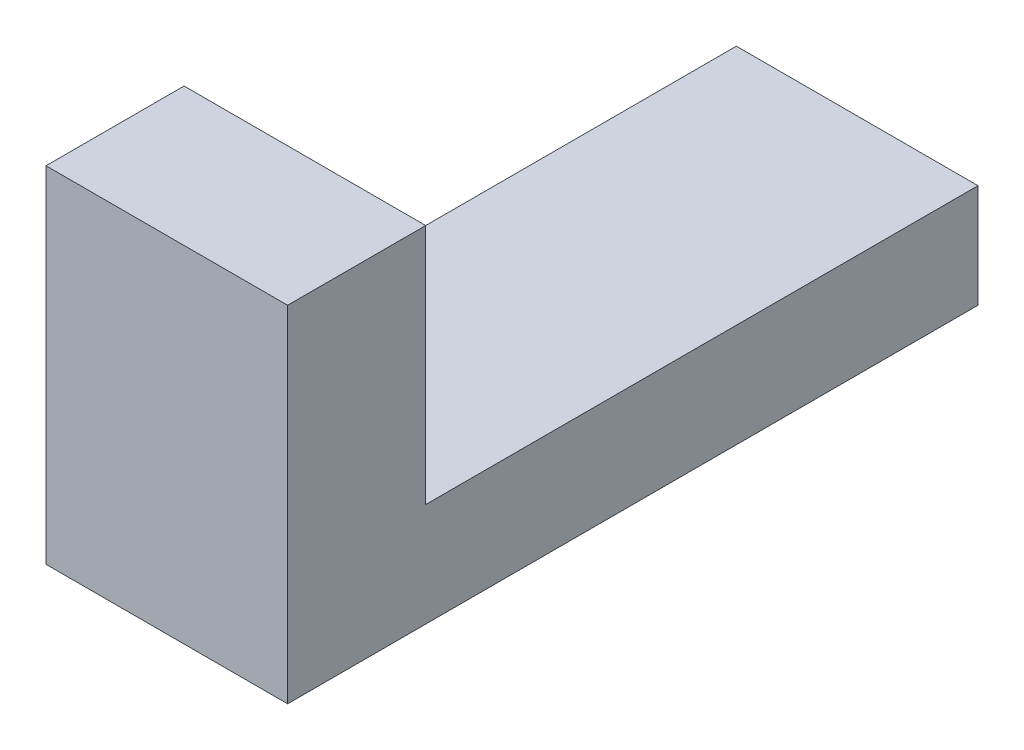
ISO-10303-21;
HEADER;
FILE_DESCRIPTION(('STEP AP214'),'2;1');
FILE_NAME('part.step','',(''),(''),'','','');
FILE_SCHEMA(('AUTOMOTIVE_DESIGN { 1 0 10303 214 1 1 1 1 }'));
ENDSEC;
DATA;
#1=APPLICATION_CONTEXT('core data for automotive mechanical design processes');
#2=APPLICATION_PROTOCOL_DEFINITION('international standard','automotive_design',2000,#1);
#3=PRODUCT_CONTEXT('',#1,'mechanical');
#4=PRODUCT('Part','Part','',(#3));
#5=PRODUCT_RELATED_PRODUCT_CATEGORY('part','',(#4));
#6=PRODUCT_DEFINITION_FORMATION('','',#4);
#7=PRODUCT_DEFINITION_CONTEXT('part definition',#1,'design');
#8=PRODUCT_DEFINITION('design','',#6,#7);
#9=PRODUCT_DEFINITION_SHAPE('','',#8);
#10=(LENGTH_UNIT() NAMED_UNIT(*) SI_UNIT(.MILLI.,.METRE.));
#11=(NAMED_UNIT(*) PLANE_ANGLE_UNIT() SI_UNIT($,.RADIAN.));
#12=(NAMED_UNIT(*) SI_UNIT($,.STERADIAN.) SOLID_ANGLE_UNIT());
#13=UNCERTAINTY_MEASURE_WITH_UNIT(LENGTH_MEASURE(1.E-05),#10,'distance_accuracy_value','');
#14=(GEOMETRIC_REPRESENTATION_CONTEXT(3) GLOBAL_UNCERTAINTY_ASSIGNED_CONTEXT((#13)) GLOBAL_UNIT_ASSIGNED_CONTEXT((#10,
#11,#12)) REPRESENTATION_CONTEXT('',''));
#15=CARTESIAN_POINT('',(0.,0.,0.));
#16=DIRECTION('',(0.,0.,1.));
#17=DIRECTION('',(1.,0.,0.));
#18=AXIS2_PLACEMENT_3D('',#15,#16,#17);
#19=CARTESIAN_POINT('',(0.,3.,20.));
#20=DIRECTION('',(0.,-1.,0.));
#21=DIRECTION('',(0.,0.,-1.));
#22=AXIS2_PLACEMENT_3D('',#19,#20,#21);
#23=PLANE('',#22);
#24=DIRECTION('',(-1.,0.,0.));
#25=VECTOR('',#24,1.);
#26=CARTESIAN_POINT('',(0.,3.,16.));
#27=LINE('',#26,#25);
#28=CARTESIAN_POINT('',(7.,3.,16.));
#29=VERTEX_POINT('',#28);
#30=CARTESIAN_POINT('',(0.,3.,16.));
#31=VERTEX_POINT('',#30);
#32=EDGE_CURVE('E61',#29,#31,#27,.T.);
#33=ORIENTED_EDGE('',*,*,#32,.F.);
#34=DIRECTION('',(0.,0.,-1.));
#35=VECTOR('',#34,1.);
#36=CARTESIAN_POINT('',(7.,3.,20.));
#37=LINE('',#36,#35);
#38=CARTESIAN_POINT('',(7.,3.,0.));
#39=VERTEX_POINT('',#38);
#40=EDGE_CURVE('E98',#29,#39,#37,.T.);
#41=ORIENTED_EDGE('',*,*,#40,.T.);
#42=DIRECTION('',(-1.,0.,0.));
#43=VECTOR('',#42,1.);
#44=CARTESIAN_POINT('',(0.,3.,0.));
#45=LINE('',#44,#43);
#46=CARTESIAN_POINT('',(0.,3.,0.));
#47=VERTEX_POINT('',#46);
#48=EDGE_CURVE('E102',#39,#47,#45,.T.);
#49=ORIENTED_EDGE('',*,*,#48,.T.);
#50=DIRECTION('',(0.,0.,-1.));
#51=VECTOR('',#50,1.);
#52=CARTESIAN_POINT('',(0.,3.,20.));
#53=LINE('',#52,#51);
#54=EDGE_CURVE('E88',#31,#47,#53,.T.);
#55=ORIENTED_EDGE('',*,*,#54,.F.);
#56=EDGE_LOOP('',(#33,#41,#49,#55));
#57=FACE_BOUND('',#56,.T.);
#58=ADVANCED_FACE('F45',(#57),#23,.F.);
#59=CARTESIAN_POINT('',(0.,0.,20.));
#60=DIRECTION('',(1.,0.,0.));
#61=DIRECTION('',(0.,0.,-1.));
#62=AXIS2_PLACEMENT_3D('',#59,#60,#61);
#63=PLANE('',#62);
#64=DIRECTION('',(0.,-1.,0.));
#65=VECTOR('',#64,1.);
#66=CARTESIAN_POINT('',(0.,0.,0.));
#67=LINE('',#66,#65);
#68=CARTESIAN_POINT('',(0.,0.,0.));
#69=VERTEX_POINT('',#68);
#70=EDGE_CURVE('E92',#47,#69,#67,.T.);
#71=ORIENTED_EDGE('',*,*,#70,.T.);
#72=DIRECTION('',(0.,0.,-1.));
#73=VECTOR('',#72,1.);
#74=CARTESIAN_POINT('',(0.,0.,20.));
#75=LINE('',#74,#73);
#76=CARTESIAN_POINT('',(0.,0.,20.));
#77=VERTEX_POINT('',#76);
#78=EDGE_CURVE('E11',#77,#69,#75,.T.);
#79=ORIENTED_EDGE('',*,*,#78,.F.);
#80=DIRECTION('',(0.,-1.,0.));
#81=VECTOR('',#80,1.);
#82=CARTESIAN_POINT('',(0.,0.,20.));
#83=LINE('',#82,#81);
#84=CARTESIAN_POINT('',(0.,10.,20.));
#85=VERTEX_POINT('',#84);
#86=EDGE_CURVE('E107',#85,#77,#83,.T.);
#87=ORIENTED_EDGE('',*,*,#86,.F.);
#88=DIRECTION('',(0.,0.,1.));
#89=VECTOR('',#88,1.);
#90=CARTESIAN_POINT('',(0.,10.,20.));
#91=LINE('',#90,#89);
#92=CARTESIAN_POINT('',(0.,10.,16.));
#93=VERTEX_POINT('',#92);
#94=EDGE_CURVE('E138',#93,#85,#91,.T.);
#95=ORIENTED_EDGE('',*,*,#94,.F.);
#96=DIRECTION('',(0.,-1.,0.));
#97=VECTOR('',#96,1.);
#98=CARTESIAN_POINT('',(0.,10.,16.));
#99=LINE('',#98,#97);
#100=EDGE_CURVE('E96',#93,#31,#99,.T.);
#101=ORIENTED_EDGE('',*,*,#100,.T.);
#102=ORIENTED_EDGE('',*,*,#54,.T.);
#103=EDGE_LOOP('',(#71,#79,#87,#95,#101,#102));
#104=FACE_BOUND('',#103,.T.);
#105=ADVANCED_FACE('F47',(#104),#63,.F.);
#106=CARTESIAN_POINT('',(0.,0.,20.));
#107=DIRECTION('',(0.,1.,0.));
#108=DIRECTION('',(0.,0.,1.));
#109=AXIS2_PLACEMENT_3D('',#106,#107,#108);
#110=PLANE('',#109);
#111=DIRECTION('',(1.,0.,0.));
#112=VECTOR('',#111,1.);
#113=CARTESIAN_POINT('',(0.,0.,0.));
#114=LINE('',#113,#112);
#115=CARTESIAN_POINT('',(7.,0.,0.));
#116=VERTEX_POINT('',#115);
#117=EDGE_CURVE('E111',#69,#116,#114,.T.);
#118=ORIENTED_EDGE('',*,*,#117,.T.);
#119=DIRECTION('',(0.,0.,-1.));
#120=VECTOR('',#119,1.);
#121=CARTESIAN_POINT('',(7.,0.,20.));
#122=LINE('',#121,#120);
#123=CARTESIAN_POINT('',(7.,0.,20.));
#124=VERTEX_POINT('',#123);
#125=EDGE_CURVE('E54',#124,#116,#122,.T.);
#126=ORIENTED_EDGE('',*,*,#125,.F.);
#127=DIRECTION('',(1.,0.,0.));
#128=VECTOR('',#127,1.);
#129=CARTESIAN_POINT('',(0.,0.,20.));
#130=LINE('',#129,#128);
#131=EDGE_CURVE('E70',#77,#124,#130,.T.);
#132=ORIENTED_EDGE('',*,*,#131,.F.);
#133=ORIENTED_EDGE('',*,*,#78,.T.);
#134=EDGE_LOOP('',(#118,#126,#132,#133));
#135=FACE_BOUND('',#134,.T.);
#136=ADVANCED_FACE('F133',(#135),#110,.F.);
#137=CARTESIAN_POINT('',(7.,0.,20.));
#138=DIRECTION('',(-1.,0.,0.));
#139=DIRECTION('',(0.,0.,1.));
#140=AXIS2_PLACEMENT_3D('',#137,#138,#139);
#141=PLANE('',#140);
#142=DIRECTION('',(0.,1.,0.));
#143=VECTOR('',#142,1.);
#144=CARTESIAN_POINT('',(7.,0.,0.));
#145=LINE('',#144,#143);
#146=EDGE_CURVE('E108',#116,#39,#145,.T.);
#147=ORIENTED_EDGE('',*,*,#146,.T.);
#148=ORIENTED_EDGE('',*,*,#40,.F.);
#149=DIRECTION('',(0.,-1.,0.));
#150=VECTOR('',#149,1.);
#151=CARTESIAN_POINT('',(7.,10.,16.));
#152=LINE('',#151,#150);
#153=CARTESIAN_POINT('',(7.,10.,16.));
#154=VERTEX_POINT('',#153);
#155=EDGE_CURVE('E113',#154,#29,#152,.T.);
#156=ORIENTED_EDGE('',*,*,#155,.F.);
#157=DIRECTION('',(0.,0.,-1.));
#158=VECTOR('',#157,1.);
#159=CARTESIAN_POINT('',(7.,10.,20.));
#160=LINE('',#159,#158);
#161=CARTESIAN_POINT('',(7.,10.,20.));
#162=VERTEX_POINT('',#161);
#163=EDGE_CURVE('E149',#162,#154,#160,.T.);
#164=ORIENTED_EDGE('',*,*,#163,.F.);
#165=DIRECTION('',(0.,1.,0.));
#166=VECTOR('',#165,1.);
#167=CARTESIAN_POINT('',(7.,0.,20.));
#168=LINE('',#167,#166);
#169=EDGE_CURVE('E99',#124,#162,#168,.T.);
#170=ORIENTED_EDGE('',*,*,#169,.F.);
#171=ORIENTED_EDGE('',*,*,#125,.T.);
#172=EDGE_LOOP('',(#147,#148,#156,#164,#170,#171));
#173=FACE_BOUND('',#172,.T.);
#174=ADVANCED_FACE('F130',(#173),#141,.F.);
#175=CARTESIAN_POINT('',(0.,0.,20.));
#176=DIRECTION('',(0.,0.,-1.));
#177=DIRECTION('',(-1.,0.,0.));
#178=AXIS2_PLACEMENT_3D('',#175,#176,#177);
#179=PLANE('',#178);
#180=ORIENTED_EDGE('',*,*,#86,.T.);
#181=ORIENTED_EDGE('',*,*,#131,.T.);
#182=ORIENTED_EDGE('',*,*,#169,.T.);
#183=DIRECTION('',(1.,0.,0.));
#184=VECTOR('',#183,1.);
#185=CARTESIAN_POINT('',(0.,10.,20.));
#186=LINE('',#185,#184);
#187=EDGE_CURVE('E144',#85,#162,#186,.T.);
#188=ORIENTED_EDGE('',*,*,#187,.F.);
#189=EDGE_LOOP('',(#180,#181,#182,#188));
#190=FACE_BOUND('',#189,.T.);
#191=ADVANCED_FACE('F145',(#190),#179,.F.);
#192=CARTESIAN_POINT('',(0.,0.,0.));
#193=DIRECTION('',(0.,0.,-1.));
#194=DIRECTION('',(-1.,0.,0.));
#195=AXIS2_PLACEMENT_3D('',#192,#193,#194);
#196=PLANE('',#195);
#197=ORIENTED_EDGE('',*,*,#70,.F.);
#198=ORIENTED_EDGE('',*,*,#48,.F.);
#199=ORIENTED_EDGE('',*,*,#146,.F.);
#200=ORIENTED_EDGE('',*,*,#117,.F.);
#201=EDGE_LOOP('',(#197,#198,#199,#200));
#202=FACE_BOUND('',#201,.T.);
#203=ADVANCED_FACE('F110',(#202),#196,.T.);
#204=CARTESIAN_POINT('',(0.,10.,16.));
#205=DIRECTION('',(0.,0.,1.));
#206=DIRECTION('',(1.,0.,0.));
#207=AXIS2_PLACEMENT_3D('',#204,#205,#206);
#208=PLANE('',#207);
#209=ORIENTED_EDGE('',*,*,#32,.T.);
#210=ORIENTED_EDGE('',*,*,#100,.F.);
#211=DIRECTION('',(-1.,0.,0.));
#212=VECTOR('',#211,1.);
#213=CARTESIAN_POINT('',(0.,10.,16.));
#214=LINE('',#213,#212);
#215=EDGE_CURVE('E154',#154,#93,#214,.T.);
#216=ORIENTED_EDGE('',*,*,#215,.F.);
#217=ORIENTED_EDGE('',*,*,#155,.T.);
#218=EDGE_LOOP('',(#209,#210,#216,#217));
#219=FACE_BOUND('',#218,.T.);
#220=ADVANCED_FACE('F171',(#219),#208,.F.);
#221=CARTESIAN_POINT('',(0.,10.,0.));
#222=DIRECTION('',(0.,-1.,0.));
#223=DIRECTION('',(0.,0.,-1.));
#224=AXIS2_PLACEMENT_3D('',#221,#222,#223);
#225=PLANE('',#224);
#226=ORIENTED_EDGE('',*,*,#94,.T.);
#227=ORIENTED_EDGE('',*,*,#187,.T.);
#228=ORIENTED_EDGE('',*,*,#163,.T.);
#229=ORIENTED_EDGE('',*,*,#215,.T.);
#230=EDGE_LOOP('',(#226,#227,#228,#229));
#231=FACE_BOUND('',#230,.T.);
#232=ADVANCED_FACE('F152',(#231),#225,.F.);
#233=CLOSED_SHELL('',(#58,#105,#136,#174,#191,#203,#220,#232));
#234=MANIFOLD_SOLID_BREP('B2',#233);
#235=ADVANCED_BREP_SHAPE_REPRESENTATION('',(#18,#234),#14);
#236=SHAPE_DEFINITION_REPRESENTATION(#9,#235);
ENDSEC;
END-ISO-10303-21;
